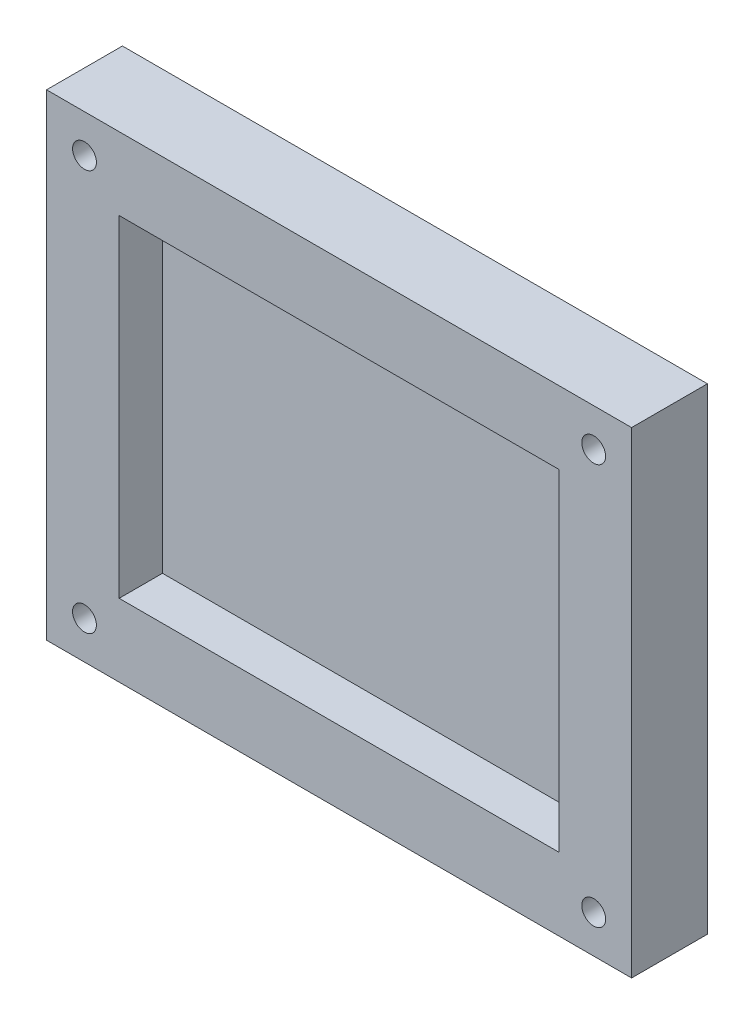
ISO-10303-21;
HEADER;
FILE_DESCRIPTION(('STEP AP214'),'2;1');
FILE_NAME('part.step','',(''),(''),'','','');
FILE_SCHEMA(('AUTOMOTIVE_DESIGN { 1 0 10303 214 1 1 1 1 }'));
ENDSEC;
DATA;
#1=APPLICATION_CONTEXT('core data for automotive mechanical design processes');
#2=APPLICATION_PROTOCOL_DEFINITION('international standard','automotive_design',2000,#1);
#3=PRODUCT_CONTEXT('',#1,'mechanical');
#4=PRODUCT('Part','Part','',(#3));
#5=PRODUCT_RELATED_PRODUCT_CATEGORY('part','',(#4));
#6=PRODUCT_DEFINITION_FORMATION('','',#4);
#7=PRODUCT_DEFINITION_CONTEXT('part definition',#1,'design');
#8=PRODUCT_DEFINITION('design','',#6,#7);
#9=PRODUCT_DEFINITION_SHAPE('','',#8);
#10=(LENGTH_UNIT() NAMED_UNIT(*) SI_UNIT(.MILLI.,.METRE.));
#11=(NAMED_UNIT(*) PLANE_ANGLE_UNIT() SI_UNIT($,.RADIAN.));
#12=(NAMED_UNIT(*) SI_UNIT($,.STERADIAN.) SOLID_ANGLE_UNIT());
#13=UNCERTAINTY_MEASURE_WITH_UNIT(LENGTH_MEASURE(1.E-05),#10,'distance_accuracy_value','');
#14=(GEOMETRIC_REPRESENTATION_CONTEXT(3) GLOBAL_UNCERTAINTY_ASSIGNED_CONTEXT((#13)) GLOBAL_UNIT_ASSIGNED_CONTEXT((#10,
#11,#12)) REPRESENTATION_CONTEXT('',''));
#15=CARTESIAN_POINT('',(0.,0.,0.));
#16=DIRECTION('',(0.,0.,1.));
#17=DIRECTION('',(1.,0.,0.));
#18=AXIS2_PLACEMENT_3D('',#15,#16,#17);
#19=CARTESIAN_POINT('',(-54.,-44.,6.));
#20=DIRECTION('',(1.,0.,0.));
#21=DIRECTION('',(0.,0.,-1.));
#22=AXIS2_PLACEMENT_3D('',#19,#20,#21);
#23=PLANE('',#22);
#24=DIRECTION('',(0.,-1.,0.));
#25=VECTOR('',#24,1.);
#26=CARTESIAN_POINT('',(-54.,-44.,0.));
#27=LINE('',#26,#25);
#28=CARTESIAN_POINT('',(-54.,44.,0.));
#29=VERTEX_POINT('',#28);
#30=CARTESIAN_POINT('',(-54.,-44.,0.));
#31=VERTEX_POINT('',#30);
#32=EDGE_CURVE('E160',#29,#31,#27,.T.);
#33=ORIENTED_EDGE('',*,*,#32,.T.);
#34=DIRECTION('',(0.,0.,-1.));
#35=VECTOR('',#34,1.);
#36=CARTESIAN_POINT('',(-54.,-44.,6.));
#37=LINE('',#36,#35);
#38=CARTESIAN_POINT('',(-54.,-44.,14.));
#39=VERTEX_POINT('',#38);
#40=EDGE_CURVE('E11',#39,#31,#37,.T.);
#41=ORIENTED_EDGE('',*,*,#40,.F.);
#42=DIRECTION('',(0.,-1.,0.));
#43=VECTOR('',#42,1.);
#44=CARTESIAN_POINT('',(-54.,-44.,14.));
#45=LINE('',#44,#43);
#46=CARTESIAN_POINT('',(-54.,44.,14.));
#47=VERTEX_POINT('',#46);
#48=EDGE_CURVE('E123',#47,#39,#45,.T.);
#49=ORIENTED_EDGE('',*,*,#48,.F.);
#50=DIRECTION('',(0.,0.,-1.));
#51=VECTOR('',#50,1.);
#52=CARTESIAN_POINT('',(-54.,44.,6.));
#53=LINE('',#52,#51);
#54=EDGE_CURVE('E168',#47,#29,#53,.T.);
#55=ORIENTED_EDGE('',*,*,#54,.T.);
#56=EDGE_LOOP('',(#33,#41,#49,#55));
#57=FACE_BOUND('',#56,.T.);
#58=ADVANCED_FACE('F41',(#57),#23,.F.);
#59=CARTESIAN_POINT('',(-54.,-44.,6.));
#60=DIRECTION('',(0.,1.,0.));
#61=DIRECTION('',(0.,0.,1.));
#62=AXIS2_PLACEMENT_3D('',#59,#60,#61);
#63=PLANE('',#62);
#64=DIRECTION('',(1.,0.,0.));
#65=VECTOR('',#64,1.);
#66=CARTESIAN_POINT('',(-54.,-44.,0.));
#67=LINE('',#66,#65);
#68=CARTESIAN_POINT('',(54.,-44.,0.));
#69=VERTEX_POINT('',#68);
#70=EDGE_CURVE('E163',#31,#69,#67,.T.);
#71=ORIENTED_EDGE('',*,*,#70,.T.);
#72=DIRECTION('',(0.,0.,-1.));
#73=VECTOR('',#72,1.);
#74=CARTESIAN_POINT('',(54.,-44.,6.));
#75=LINE('',#74,#73);
#76=CARTESIAN_POINT('',(54.,-44.,14.));
#77=VERTEX_POINT('',#76);
#78=EDGE_CURVE('E48',#77,#69,#75,.T.);
#79=ORIENTED_EDGE('',*,*,#78,.F.);
#80=DIRECTION('',(1.,0.,0.));
#81=VECTOR('',#80,1.);
#82=CARTESIAN_POINT('',(-54.,-44.,14.));
#83=LINE('',#82,#81);
#84=EDGE_CURVE('E151',#39,#77,#83,.T.);
#85=ORIENTED_EDGE('',*,*,#84,.F.);
#86=ORIENTED_EDGE('',*,*,#40,.T.);
#87=EDGE_LOOP('',(#71,#79,#85,#86));
#88=FACE_BOUND('',#87,.T.);
#89=ADVANCED_FACE('F186',(#88),#63,.F.);
#90=CARTESIAN_POINT('',(54.,-44.,6.));
#91=DIRECTION('',(-1.,0.,0.));
#92=DIRECTION('',(0.,0.,1.));
#93=AXIS2_PLACEMENT_3D('',#90,#91,#92);
#94=PLANE('',#93);
#95=DIRECTION('',(0.,1.,0.));
#96=VECTOR('',#95,1.);
#97=CARTESIAN_POINT('',(54.,-44.,0.));
#98=LINE('',#97,#96);
#99=CARTESIAN_POINT('',(54.,44.,0.));
#100=VERTEX_POINT('',#99);
#101=EDGE_CURVE('E165',#69,#100,#98,.T.);
#102=ORIENTED_EDGE('',*,*,#101,.T.);
#103=DIRECTION('',(0.,0.,-1.));
#104=VECTOR('',#103,1.);
#105=CARTESIAN_POINT('',(54.,44.,6.));
#106=LINE('',#105,#104);
#107=CARTESIAN_POINT('',(54.,44.,14.));
#108=VERTEX_POINT('',#107);
#109=EDGE_CURVE('E170',#108,#100,#106,.T.);
#110=ORIENTED_EDGE('',*,*,#109,.F.);
#111=DIRECTION('',(0.,1.,0.));
#112=VECTOR('',#111,1.);
#113=CARTESIAN_POINT('',(54.,-44.,14.));
#114=LINE('',#113,#112);
#115=EDGE_CURVE('E154',#77,#108,#114,.T.);
#116=ORIENTED_EDGE('',*,*,#115,.F.);
#117=ORIENTED_EDGE('',*,*,#78,.T.);
#118=EDGE_LOOP('',(#102,#110,#116,#117));
#119=FACE_BOUND('',#118,.T.);
#120=ADVANCED_FACE('F175',(#119),#94,.F.);
#121=CARTESIAN_POINT('',(-54.,44.,6.));
#122=DIRECTION('',(0.,-1.,0.));
#123=DIRECTION('',(0.,0.,-1.));
#124=AXIS2_PLACEMENT_3D('',#121,#122,#123);
#125=PLANE('',#124);
#126=DIRECTION('',(-1.,0.,0.));
#127=VECTOR('',#126,1.);
#128=CARTESIAN_POINT('',(-54.,44.,0.));
#129=LINE('',#128,#127);
#130=EDGE_CURVE('E63',#100,#29,#129,.T.);
#131=ORIENTED_EDGE('',*,*,#130,.T.);
#132=ORIENTED_EDGE('',*,*,#54,.F.);
#133=DIRECTION('',(-1.,0.,0.));
#134=VECTOR('',#133,1.);
#135=CARTESIAN_POINT('',(-54.,44.,14.));
#136=LINE('',#135,#134);
#137=EDGE_CURVE('E157',#108,#47,#136,.T.);
#138=ORIENTED_EDGE('',*,*,#137,.F.);
#139=ORIENTED_EDGE('',*,*,#109,.T.);
#140=EDGE_LOOP('',(#131,#132,#138,#139));
#141=FACE_BOUND('',#140,.T.);
#142=ADVANCED_FACE('F184',(#141),#125,.F.);
#143=CARTESIAN_POINT('',(0.,0.,0.));
#144=DIRECTION('',(0.,0.,-1.));
#145=DIRECTION('',(-1.,0.,0.));
#146=AXIS2_PLACEMENT_3D('',#143,#144,#145);
#147=PLANE('',#146);
#148=CARTESIAN_POINT('',(47.,37.,0.));
#149=DIRECTION('',(0.,0.,1.));
#150=DIRECTION('',(1.,0.,0.));
#151=AXIS2_PLACEMENT_3D('',#148,#149,#150);
#152=CIRCLE('',#151,2.2);
#153=CARTESIAN_POINT('',(49.2,37.,0.));
#154=VERTEX_POINT('',#153);
#155=EDGE_CURVE('E240',#154,#154,#152,.T.);
#156=ORIENTED_EDGE('',*,*,#155,.T.);
#157=EDGE_LOOP('',(#156));
#158=FACE_BOUND('',#157,.T.);
#159=CARTESIAN_POINT('',(47.,-37.,0.));
#160=DIRECTION('',(0.,0.,1.));
#161=DIRECTION('',(1.,0.,0.));
#162=AXIS2_PLACEMENT_3D('',#159,#160,#161);
#163=CIRCLE('',#162,2.2);
#164=CARTESIAN_POINT('',(49.2,-37.,0.));
#165=VERTEX_POINT('',#164);
#166=EDGE_CURVE('E242',#165,#165,#163,.T.);
#167=ORIENTED_EDGE('',*,*,#166,.T.);
#168=EDGE_LOOP('',(#167));
#169=FACE_BOUND('',#168,.T.);
#170=CARTESIAN_POINT('',(-47.,37.,0.));
#171=DIRECTION('',(0.,0.,1.));
#172=DIRECTION('',(1.,0.,0.));
#173=AXIS2_PLACEMENT_3D('',#170,#171,#172);
#174=CIRCLE('',#173,2.2);
#175=CARTESIAN_POINT('',(-44.8,37.,0.));
#176=VERTEX_POINT('',#175);
#177=EDGE_CURVE('E248',#176,#176,#174,.T.);
#178=ORIENTED_EDGE('',*,*,#177,.T.);
#179=EDGE_LOOP('',(#178));
#180=FACE_BOUND('',#179,.T.);
#181=CARTESIAN_POINT('',(-47.,-37.,0.));
#182=DIRECTION('',(0.,0.,1.));
#183=DIRECTION('',(1.,0.,0.));
#184=AXIS2_PLACEMENT_3D('',#181,#182,#183);
#185=CIRCLE('',#184,2.2);
#186=CARTESIAN_POINT('',(-44.8,-37.,0.));
#187=VERTEX_POINT('',#186);
#188=EDGE_CURVE('E254',#187,#187,#185,.T.);
#189=ORIENTED_EDGE('',*,*,#188,.T.);
#190=EDGE_LOOP('',(#189));
#191=FACE_BOUND('',#190,.T.);
#192=ORIENTED_EDGE('',*,*,#32,.F.);
#193=ORIENTED_EDGE('',*,*,#130,.F.);
#194=ORIENTED_EDGE('',*,*,#101,.F.);
#195=ORIENTED_EDGE('',*,*,#70,.F.);
#196=EDGE_LOOP('',(#192,#193,#194,#195));
#197=FACE_BOUND('',#196,.T.);
#198=ADVANCED_FACE('F180',(#158,#169,#180,#191,#197),#147,.T.);
#199=CARTESIAN_POINT('',(0.,0.,14.));
#200=DIRECTION('',(0.,0.,-1.));
#201=DIRECTION('',(-1.,0.,0.));
#202=AXIS2_PLACEMENT_3D('',#199,#200,#201);
#203=PLANE('',#202);
#204=CARTESIAN_POINT('',(47.,37.,14.));
#205=DIRECTION('',(0.,0.,1.));
#206=DIRECTION('',(1.,0.,0.));
#207=AXIS2_PLACEMENT_3D('',#204,#205,#206);
#208=CIRCLE('',#207,2.2);
#209=CARTESIAN_POINT('',(49.2,37.,14.));
#210=VERTEX_POINT('',#209);
#211=EDGE_CURVE('E237',#210,#210,#208,.T.);
#212=ORIENTED_EDGE('',*,*,#211,.F.);
#213=EDGE_LOOP('',(#212));
#214=FACE_BOUND('',#213,.T.);
#215=CARTESIAN_POINT('',(47.,-37.,14.));
#216=DIRECTION('',(0.,0.,1.));
#217=DIRECTION('',(1.,0.,0.));
#218=AXIS2_PLACEMENT_3D('',#215,#216,#217);
#219=CIRCLE('',#218,2.2);
#220=CARTESIAN_POINT('',(49.2,-37.,14.));
#221=VERTEX_POINT('',#220);
#222=EDGE_CURVE('E245',#221,#221,#219,.T.);
#223=ORIENTED_EDGE('',*,*,#222,.F.);
#224=EDGE_LOOP('',(#223));
#225=FACE_BOUND('',#224,.T.);
#226=CARTESIAN_POINT('',(-47.,37.,14.));
#227=DIRECTION('',(0.,0.,1.));
#228=DIRECTION('',(1.,0.,0.));
#229=AXIS2_PLACEMENT_3D('',#226,#227,#228);
#230=CIRCLE('',#229,2.2);
#231=CARTESIAN_POINT('',(-44.8,37.,14.));
#232=VERTEX_POINT('',#231);
#233=EDGE_CURVE('E251',#232,#232,#230,.T.);
#234=ORIENTED_EDGE('',*,*,#233,.F.);
#235=EDGE_LOOP('',(#234));
#236=FACE_BOUND('',#235,.T.);
#237=CARTESIAN_POINT('',(-47.,-37.,14.));
#238=DIRECTION('',(0.,0.,1.));
#239=DIRECTION('',(1.,0.,0.));
#240=AXIS2_PLACEMENT_3D('',#237,#238,#239);
#241=CIRCLE('',#240,2.2);
#242=CARTESIAN_POINT('',(-44.8,-37.,14.));
#243=VERTEX_POINT('',#242);
#244=EDGE_CURVE('E138',#243,#243,#241,.T.);
#245=ORIENTED_EDGE('',*,*,#244,.F.);
#246=EDGE_LOOP('',(#245));
#247=FACE_BOUND('',#246,.T.);
#248=ORIENTED_EDGE('',*,*,#48,.T.);
#249=ORIENTED_EDGE('',*,*,#84,.T.);
#250=ORIENTED_EDGE('',*,*,#115,.T.);
#251=ORIENTED_EDGE('',*,*,#137,.T.);
#252=EDGE_LOOP('',(#248,#249,#250,#251));
#253=FACE_BOUND('',#252,.T.);
#254=DIRECTION('',(0.,-1.,0.));
#255=VECTOR('',#254,1.);
#256=CARTESIAN_POINT('',(-40.6,-30.6,14.));
#257=LINE('',#256,#255);
#258=CARTESIAN_POINT('',(-40.6,30.6,14.));
#259=VERTEX_POINT('',#258);
#260=CARTESIAN_POINT('',(-40.6,-30.6,14.));
#261=VERTEX_POINT('',#260);
#262=EDGE_CURVE('E107',#259,#261,#257,.T.);
#263=ORIENTED_EDGE('',*,*,#262,.F.);
#264=DIRECTION('',(-1.,0.,0.));
#265=VECTOR('',#264,1.);
#266=CARTESIAN_POINT('',(-40.6,30.6,14.));
#267=LINE('',#266,#265);
#268=CARTESIAN_POINT('',(40.6,30.6,14.));
#269=VERTEX_POINT('',#268);
#270=EDGE_CURVE('E131',#269,#259,#267,.T.);
#271=ORIENTED_EDGE('',*,*,#270,.F.);
#272=DIRECTION('',(0.,1.,0.));
#273=VECTOR('',#272,1.);
#274=CARTESIAN_POINT('',(40.6,-30.6,14.));
#275=LINE('',#274,#273);
#276=CARTESIAN_POINT('',(40.6,-30.6,14.));
#277=VERTEX_POINT('',#276);
#278=EDGE_CURVE('E129',#277,#269,#275,.T.);
#279=ORIENTED_EDGE('',*,*,#278,.F.);
#280=DIRECTION('',(1.,0.,0.));
#281=VECTOR('',#280,1.);
#282=CARTESIAN_POINT('',(-40.6,-30.6,14.));
#283=LINE('',#282,#281);
#284=EDGE_CURVE('E115',#261,#277,#283,.T.);
#285=ORIENTED_EDGE('',*,*,#284,.F.);
#286=EDGE_LOOP('',(#263,#271,#279,#285));
#287=FACE_BOUND('',#286,.T.);
#288=ADVANCED_FACE('F127',(#214,#225,#236,#247,#253,#287),#203,.F.);
#289=CARTESIAN_POINT('',(-40.6,-30.6,14.));
#290=DIRECTION('',(1.,0.,0.));
#291=DIRECTION('',(0.,0.,-1.));
#292=AXIS2_PLACEMENT_3D('',#289,#290,#291);
#293=PLANE('',#292);
#294=DIRECTION('',(0.,-1.,0.));
#295=VECTOR('',#294,1.);
#296=CARTESIAN_POINT('',(-40.6,-30.6,6.));
#297=LINE('',#296,#295);
#298=CARTESIAN_POINT('',(-40.6,30.6,6.));
#299=VERTEX_POINT('',#298);
#300=CARTESIAN_POINT('',(-40.6,-30.6,6.));
#301=VERTEX_POINT('',#300);
#302=EDGE_CURVE('E136',#299,#301,#297,.T.);
#303=ORIENTED_EDGE('',*,*,#302,.F.);
#304=DIRECTION('',(0.,0.,-1.));
#305=VECTOR('',#304,1.);
#306=CARTESIAN_POINT('',(-40.6,30.6,14.));
#307=LINE('',#306,#305);
#308=EDGE_CURVE('E55',#259,#299,#307,.T.);
#309=ORIENTED_EDGE('',*,*,#308,.F.);
#310=ORIENTED_EDGE('',*,*,#262,.T.);
#311=DIRECTION('',(0.,0.,-1.));
#312=VECTOR('',#311,1.);
#313=CARTESIAN_POINT('',(-40.6,-30.6,14.));
#314=LINE('',#313,#312);
#315=EDGE_CURVE('E110',#261,#301,#314,.T.);
#316=ORIENTED_EDGE('',*,*,#315,.T.);
#317=EDGE_LOOP('',(#303,#309,#310,#316));
#318=FACE_BOUND('',#317,.T.);
#319=ADVANCED_FACE('F109',(#318),#293,.T.);
#320=CARTESIAN_POINT('',(-40.6,-30.6,14.));
#321=DIRECTION('',(0.,1.,0.));
#322=DIRECTION('',(0.,0.,1.));
#323=AXIS2_PLACEMENT_3D('',#320,#321,#322);
#324=PLANE('',#323);
#325=DIRECTION('',(1.,0.,0.));
#326=VECTOR('',#325,1.);
#327=CARTESIAN_POINT('',(-40.6,-30.6,6.));
#328=LINE('',#327,#326);
#329=CARTESIAN_POINT('',(40.6,-30.6,6.));
#330=VERTEX_POINT('',#329);
#331=EDGE_CURVE('E122',#301,#330,#328,.T.);
#332=ORIENTED_EDGE('',*,*,#331,.F.);
#333=ORIENTED_EDGE('',*,*,#315,.F.);
#334=ORIENTED_EDGE('',*,*,#284,.T.);
#335=DIRECTION('',(0.,0.,-1.));
#336=VECTOR('',#335,1.);
#337=CARTESIAN_POINT('',(40.6,-30.6,14.));
#338=LINE('',#337,#336);
#339=EDGE_CURVE('E124',#277,#330,#338,.T.);
#340=ORIENTED_EDGE('',*,*,#339,.T.);
#341=EDGE_LOOP('',(#332,#333,#334,#340));
#342=FACE_BOUND('',#341,.T.);
#343=ADVANCED_FACE('F119',(#342),#324,.T.);
#344=CARTESIAN_POINT('',(40.6,-30.6,14.));
#345=DIRECTION('',(-1.,0.,0.));
#346=DIRECTION('',(0.,0.,1.));
#347=AXIS2_PLACEMENT_3D('',#344,#345,#346);
#348=PLANE('',#347);
#349=DIRECTION('',(0.,1.,0.));
#350=VECTOR('',#349,1.);
#351=CARTESIAN_POINT('',(40.6,-30.6,6.));
#352=LINE('',#351,#350);
#353=CARTESIAN_POINT('',(40.6,30.6,6.));
#354=VERTEX_POINT('',#353);
#355=EDGE_CURVE('E140',#330,#354,#352,.T.);
#356=ORIENTED_EDGE('',*,*,#355,.F.);
#357=ORIENTED_EDGE('',*,*,#339,.F.);
#358=ORIENTED_EDGE('',*,*,#278,.T.);
#359=DIRECTION('',(0.,0.,-1.));
#360=VECTOR('',#359,1.);
#361=CARTESIAN_POINT('',(40.6,30.6,14.));
#362=LINE('',#361,#360);
#363=EDGE_CURVE('E146',#269,#354,#362,.T.);
#364=ORIENTED_EDGE('',*,*,#363,.T.);
#365=EDGE_LOOP('',(#356,#357,#358,#364));
#366=FACE_BOUND('',#365,.T.);
#367=ADVANCED_FACE('F212',(#366),#348,.T.);
#368=CARTESIAN_POINT('',(-40.6,30.6,14.));
#369=DIRECTION('',(0.,-1.,0.));
#370=DIRECTION('',(0.,0.,-1.));
#371=AXIS2_PLACEMENT_3D('',#368,#369,#370);
#372=PLANE('',#371);
#373=DIRECTION('',(-1.,0.,0.));
#374=VECTOR('',#373,1.);
#375=CARTESIAN_POINT('',(-40.6,30.6,6.));
#376=LINE('',#375,#374);
#377=EDGE_CURVE('E116',#354,#299,#376,.T.);
#378=ORIENTED_EDGE('',*,*,#377,.F.);
#379=ORIENTED_EDGE('',*,*,#363,.F.);
#380=ORIENTED_EDGE('',*,*,#270,.T.);
#381=ORIENTED_EDGE('',*,*,#308,.T.);
#382=EDGE_LOOP('',(#378,#379,#380,#381));
#383=FACE_BOUND('',#382,.T.);
#384=ADVANCED_FACE('F203',(#383),#372,.T.);
#385=CARTESIAN_POINT('',(0.,0.,6.));
#386=DIRECTION('',(0.,0.,-1.));
#387=DIRECTION('',(-1.,0.,0.));
#388=AXIS2_PLACEMENT_3D('',#385,#386,#387);
#389=PLANE('',#388);
#390=ORIENTED_EDGE('',*,*,#377,.T.);
#391=ORIENTED_EDGE('',*,*,#302,.T.);
#392=ORIENTED_EDGE('',*,*,#331,.T.);
#393=ORIENTED_EDGE('',*,*,#355,.T.);
#394=EDGE_LOOP('',(#390,#391,#392,#393));
#395=FACE_BOUND('',#394,.T.);
#396=ADVANCED_FACE('F199',(#395),#389,.F.);
#397=CARTESIAN_POINT('',(-47.,-37.,14.));
#398=DIRECTION('',(0.,0.,-1.));
#399=DIRECTION('',(-1.,0.,0.));
#400=AXIS2_PLACEMENT_3D('',#397,#398,#399);
#401=CYLINDRICAL_SURFACE('',#400,2.2);
#402=ORIENTED_EDGE('',*,*,#244,.T.);
#403=EDGE_LOOP('',(#402));
#404=FACE_BOUND('',#403,.T.);
#405=ORIENTED_EDGE('',*,*,#188,.F.);
#406=EDGE_LOOP('',(#405));
#407=FACE_BOUND('',#406,.T.);
#408=ADVANCED_FACE('F202',(#404,#407),#401,.F.);
#409=CARTESIAN_POINT('',(-47.,37.,14.));
#410=DIRECTION('',(0.,0.,-1.));
#411=DIRECTION('',(-1.,0.,0.));
#412=AXIS2_PLACEMENT_3D('',#409,#410,#411);
#413=CYLINDRICAL_SURFACE('',#412,2.2);
#414=ORIENTED_EDGE('',*,*,#233,.T.);
#415=EDGE_LOOP('',(#414));
#416=FACE_BOUND('',#415,.T.);
#417=ORIENTED_EDGE('',*,*,#177,.F.);
#418=EDGE_LOOP('',(#417));
#419=FACE_BOUND('',#418,.T.);
#420=ADVANCED_FACE('F220',(#416,#419),#413,.F.);
#421=CARTESIAN_POINT('',(47.,-37.,14.));
#422=DIRECTION('',(0.,0.,-1.));
#423=DIRECTION('',(-1.,0.,0.));
#424=AXIS2_PLACEMENT_3D('',#421,#422,#423);
#425=CYLINDRICAL_SURFACE('',#424,2.2);
#426=ORIENTED_EDGE('',*,*,#222,.T.);
#427=EDGE_LOOP('',(#426));
#428=FACE_BOUND('',#427,.T.);
#429=ORIENTED_EDGE('',*,*,#166,.F.);
#430=EDGE_LOOP('',(#429));
#431=FACE_BOUND('',#430,.T.);
#432=ADVANCED_FACE('F224',(#428,#431),#425,.F.);
#433=CARTESIAN_POINT('',(47.,37.,14.));
#434=DIRECTION('',(0.,0.,-1.));
#435=DIRECTION('',(-1.,0.,0.));
#436=AXIS2_PLACEMENT_3D('',#433,#434,#435);
#437=CYLINDRICAL_SURFACE('',#436,2.2);
#438=ORIENTED_EDGE('',*,*,#211,.T.);
#439=EDGE_LOOP('',(#438));
#440=FACE_BOUND('',#439,.T.);
#441=ORIENTED_EDGE('',*,*,#155,.F.);
#442=EDGE_LOOP('',(#441));
#443=FACE_BOUND('',#442,.T.);
#444=ADVANCED_FACE('F228',(#440,#443),#437,.F.);
#445=CLOSED_SHELL('',(#58,#89,#120,#142,#198,#288,#319,#343,#367,#384,#396,#408,#420,#432,#444));
#446=MANIFOLD_SOLID_BREP('B2',#445);
#447=ADVANCED_BREP_SHAPE_REPRESENTATION('',(#18,#446),#14);
#448=SHAPE_DEFINITION_REPRESENTATION(#9,#447);
ENDSEC;
END-ISO-10303-21;
